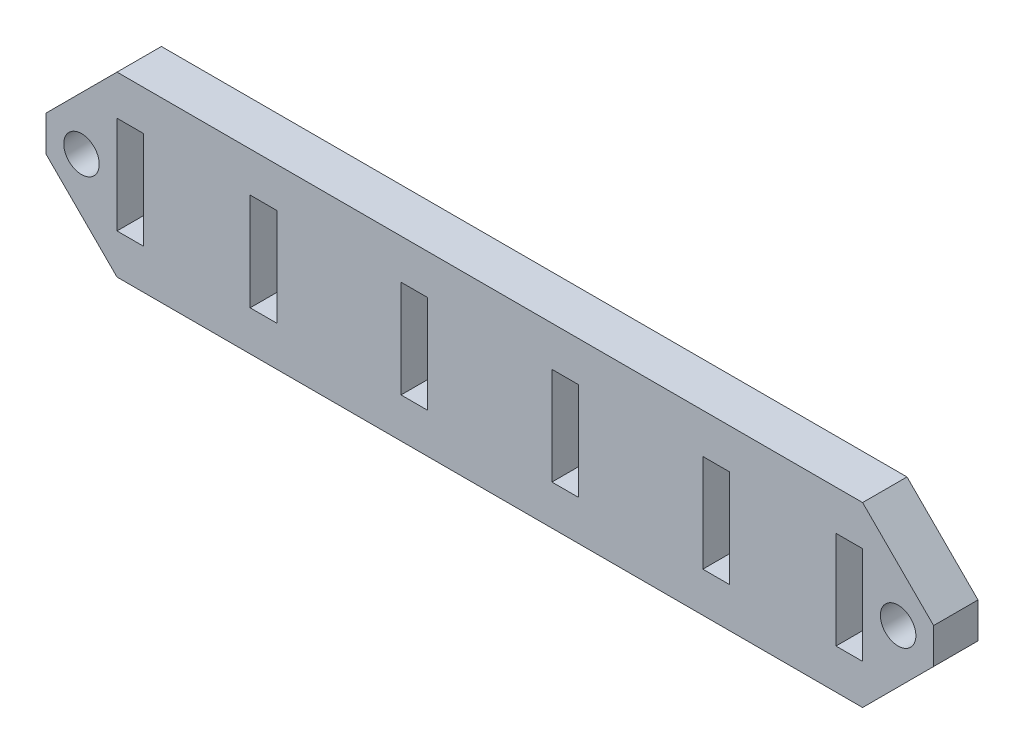
ISO-10303-21;
HEADER;
FILE_DESCRIPTION(('STEP AP214'),'2;1');
FILE_NAME('part.step','',(''),(''),'','','');
FILE_SCHEMA(('AUTOMOTIVE_DESIGN { 1 0 10303 214 1 1 1 1 }'));
ENDSEC;
DATA;
#1=APPLICATION_CONTEXT('core data for automotive mechanical design processes');
#2=APPLICATION_PROTOCOL_DEFINITION('international standard','automotive_design',2000,#1);
#3=PRODUCT_CONTEXT('',#1,'mechanical');
#4=PRODUCT('Part','Part','',(#3));
#5=PRODUCT_RELATED_PRODUCT_CATEGORY('part','',(#4));
#6=PRODUCT_DEFINITION_FORMATION('','',#4);
#7=PRODUCT_DEFINITION_CONTEXT('part definition',#1,'design');
#8=PRODUCT_DEFINITION('design','',#6,#7);
#9=PRODUCT_DEFINITION_SHAPE('','',#8);
#10=(LENGTH_UNIT() NAMED_UNIT(*) SI_UNIT(.MILLI.,.METRE.));
#11=(NAMED_UNIT(*) PLANE_ANGLE_UNIT() SI_UNIT($,.RADIAN.));
#12=(NAMED_UNIT(*) SI_UNIT($,.STERADIAN.) SOLID_ANGLE_UNIT());
#13=UNCERTAINTY_MEASURE_WITH_UNIT(LENGTH_MEASURE(1.E-05),#10,'distance_accuracy_value','');
#14=(GEOMETRIC_REPRESENTATION_CONTEXT(3) GLOBAL_UNCERTAINTY_ASSIGNED_CONTEXT((#13)) GLOBAL_UNIT_ASSIGNED_CONTEXT((#10,
#11,#12)) REPRESENTATION_CONTEXT('',''));
#15=CARTESIAN_POINT('',(0.,0.,0.));
#16=DIRECTION('',(0.,0.,1.));
#17=DIRECTION('',(1.,0.,0.));
#18=AXIS2_PLACEMENT_3D('',#15,#16,#17);
#19=CARTESIAN_POINT('',(100.,20.,5.));
#20=DIRECTION('',(1.,0.,0.));
#21=DIRECTION('',(0.,1.,0.));
#22=AXIS2_PLACEMENT_3D('',#19,#20,#21);
#23=PLANE('',#22);
#24=DIRECTION('',(0.,0.,-1.));
#25=VECTOR('',#24,1.);
#26=CARTESIAN_POINT('',(100.,8.,5.));
#27=LINE('',#26,#25);
#28=CARTESIAN_POINT('',(100.,8.,5.));
#29=VERTEX_POINT('',#28);
#30=CARTESIAN_POINT('',(100.,8.,0.));
#31=VERTEX_POINT('',#30);
#32=EDGE_CURVE('E604',#29,#31,#27,.T.);
#33=ORIENTED_EDGE('',*,*,#32,.T.);
#34=DIRECTION('',(0.,-1.,0.));
#35=VECTOR('',#34,1.);
#36=CARTESIAN_POINT('',(100.,20.,0.));
#37=LINE('',#36,#35);
#38=CARTESIAN_POINT('',(100.,12.,0.));
#39=VERTEX_POINT('',#38);
#40=EDGE_CURVE('E279',#39,#31,#37,.T.);
#41=ORIENTED_EDGE('',*,*,#40,.F.);
#42=DIRECTION('',(0.,0.,-1.));
#43=VECTOR('',#42,1.);
#44=CARTESIAN_POINT('',(100.,12.,5.));
#45=LINE('',#44,#43);
#46=CARTESIAN_POINT('',(100.,12.,5.));
#47=VERTEX_POINT('',#46);
#48=EDGE_CURVE('E580',#47,#39,#45,.T.);
#49=ORIENTED_EDGE('',*,*,#48,.F.);
#50=DIRECTION('',(0.,-1.,0.));
#51=VECTOR('',#50,1.);
#52=CARTESIAN_POINT('',(100.,20.,5.));
#53=LINE('',#52,#51);
#54=EDGE_CURVE('E275',#47,#29,#53,.T.);
#55=ORIENTED_EDGE('',*,*,#54,.T.);
#56=EDGE_LOOP('',(#33,#41,#49,#55));
#57=FACE_BOUND('',#56,.T.);
#58=ADVANCED_FACE('F39',(#57),#23,.T.);
#59=CARTESIAN_POINT('',(100.,20.,5.));
#60=DIRECTION('',(0.,-1.,0.));
#61=DIRECTION('',(0.,0.,-1.));
#62=AXIS2_PLACEMENT_3D('',#59,#60,#61);
#63=PLANE('',#62);
#64=DIRECTION('',(-1.,0.,0.));
#65=VECTOR('',#64,1.);
#66=CARTESIAN_POINT('',(100.,20.,0.));
#67=LINE('',#66,#65);
#68=CARTESIAN_POINT('',(92.,20.,0.));
#69=VERTEX_POINT('',#68);
#70=CARTESIAN_POINT('',(8.00000000000001,20.,0.));
#71=VERTEX_POINT('',#70);
#72=EDGE_CURVE('E42',#69,#71,#67,.T.);
#73=ORIENTED_EDGE('',*,*,#72,.T.);
#74=DIRECTION('',(0.,0.,-1.));
#75=VECTOR('',#74,1.);
#76=CARTESIAN_POINT('',(8.,20.,5.));
#77=LINE('',#76,#75);
#78=CARTESIAN_POINT('',(8.,20.,5.));
#79=VERTEX_POINT('',#78);
#80=EDGE_CURVE('E56',#79,#71,#77,.T.);
#81=ORIENTED_EDGE('',*,*,#80,.F.);
#82=DIRECTION('',(-1.,0.,0.));
#83=VECTOR('',#82,1.);
#84=CARTESIAN_POINT('',(100.,20.,5.));
#85=LINE('',#84,#83);
#86=CARTESIAN_POINT('',(92.,20.,5.));
#87=VERTEX_POINT('',#86);
#88=EDGE_CURVE('E11',#87,#79,#85,.T.);
#89=ORIENTED_EDGE('',*,*,#88,.F.);
#90=DIRECTION('',(0.,0.,-1.));
#91=VECTOR('',#90,1.);
#92=CARTESIAN_POINT('',(92.,20.,5.));
#93=LINE('',#92,#91);
#94=EDGE_CURVE('E525',#87,#69,#93,.T.);
#95=ORIENTED_EDGE('',*,*,#94,.T.);
#96=EDGE_LOOP('',(#73,#81,#89,#95));
#97=FACE_BOUND('',#96,.T.);
#98=ADVANCED_FACE('F632',(#97),#63,.F.);
#99=CARTESIAN_POINT('',(0.,20.,5.));
#100=DIRECTION('',(1.,0.,0.));
#101=DIRECTION('',(0.,0.,-1.));
#102=AXIS2_PLACEMENT_3D('',#99,#100,#101);
#103=PLANE('',#102);
#104=DIRECTION('',(0.,-1.,0.));
#105=VECTOR('',#104,1.);
#106=CARTESIAN_POINT('',(0.,20.,5.));
#107=LINE('',#106,#105);
#108=CARTESIAN_POINT('',(0.,12.,5.));
#109=VERTEX_POINT('',#108);
#110=CARTESIAN_POINT('',(0.,8.,5.));
#111=VERTEX_POINT('',#110);
#112=EDGE_CURVE('E48',#109,#111,#107,.T.);
#113=ORIENTED_EDGE('',*,*,#112,.F.);
#114=DIRECTION('',(0.,0.,-1.));
#115=VECTOR('',#114,1.);
#116=CARTESIAN_POINT('',(0.,12.,5.));
#117=LINE('',#116,#115);
#118=CARTESIAN_POINT('',(0.,12.,0.));
#119=VERTEX_POINT('',#118);
#120=EDGE_CURVE('E593',#109,#119,#117,.T.);
#121=ORIENTED_EDGE('',*,*,#120,.T.);
#122=DIRECTION('',(0.,-1.,0.));
#123=VECTOR('',#122,1.);
#124=CARTESIAN_POINT('',(0.,20.,0.));
#125=LINE('',#124,#123);
#126=CARTESIAN_POINT('',(0.,8.,0.));
#127=VERTEX_POINT('',#126);
#128=EDGE_CURVE('E265',#119,#127,#125,.T.);
#129=ORIENTED_EDGE('',*,*,#128,.T.);
#130=DIRECTION('',(0.,0.,-1.));
#131=VECTOR('',#130,1.);
#132=CARTESIAN_POINT('',(0.,8.,5.));
#133=LINE('',#132,#131);
#134=EDGE_CURVE('E64',#111,#127,#133,.T.);
#135=ORIENTED_EDGE('',*,*,#134,.F.);
#136=EDGE_LOOP('',(#113,#121,#129,#135));
#137=FACE_BOUND('',#136,.T.);
#138=ADVANCED_FACE('F262',(#137),#103,.F.);
#139=CARTESIAN_POINT('',(100.,0.,5.));
#140=DIRECTION('',(0.,-1.,0.));
#141=DIRECTION('',(1.,0.,0.));
#142=AXIS2_PLACEMENT_3D('',#139,#140,#141);
#143=PLANE('',#142);
#144=DIRECTION('',(0.,0.,-1.));
#145=VECTOR('',#144,1.);
#146=CARTESIAN_POINT('',(92.,0.,5.));
#147=LINE('',#146,#145);
#148=CARTESIAN_POINT('',(92.,0.,5.));
#149=VERTEX_POINT('',#148);
#150=CARTESIAN_POINT('',(92.,0.,0.));
#151=VERTEX_POINT('',#150);
#152=EDGE_CURVE('E589',#149,#151,#147,.T.);
#153=ORIENTED_EDGE('',*,*,#152,.F.);
#154=DIRECTION('',(-1.,0.,0.));
#155=VECTOR('',#154,1.);
#156=CARTESIAN_POINT('',(100.,0.,5.));
#157=LINE('',#156,#155);
#158=CARTESIAN_POINT('',(8.00000000000001,0.,5.));
#159=VERTEX_POINT('',#158);
#160=EDGE_CURVE('E272',#149,#159,#157,.T.);
#161=ORIENTED_EDGE('',*,*,#160,.T.);
#162=DIRECTION('',(0.,0.,-1.));
#163=VECTOR('',#162,1.);
#164=CARTESIAN_POINT('',(8.00000000000001,0.,5.));
#165=LINE('',#164,#163);
#166=CARTESIAN_POINT('',(8.00000000000001,0.,0.));
#167=VERTEX_POINT('',#166);
#168=EDGE_CURVE('E251',#159,#167,#165,.T.);
#169=ORIENTED_EDGE('',*,*,#168,.T.);
#170=DIRECTION('',(-1.,0.,0.));
#171=VECTOR('',#170,1.);
#172=CARTESIAN_POINT('',(100.,0.,0.));
#173=LINE('',#172,#171);
#174=EDGE_CURVE('E283',#151,#167,#173,.T.);
#175=ORIENTED_EDGE('',*,*,#174,.F.);
#176=EDGE_LOOP('',(#153,#161,#169,#175));
#177=FACE_BOUND('',#176,.T.);
#178=ADVANCED_FACE('F622',(#177),#143,.T.);
#179=CARTESIAN_POINT('',(0.,0.,5.));
#180=DIRECTION('',(0.,0.,-1.));
#181=DIRECTION('',(-1.,0.,0.));
#182=AXIS2_PLACEMENT_3D('',#179,#180,#181);
#183=PLANE('',#182);
#184=DIRECTION('',(1.,0.,0.));
#185=VECTOR('',#184,1.);
#186=CARTESIAN_POINT('',(77.,15.5,5.));
#187=LINE('',#186,#185);
#188=CARTESIAN_POINT('',(74.,15.5,5.));
#189=VERTEX_POINT('',#188);
#190=CARTESIAN_POINT('',(77.,15.5,5.));
#191=VERTEX_POINT('',#190);
#192=EDGE_CURVE('E483',#189,#191,#187,.T.);
#193=ORIENTED_EDGE('',*,*,#192,.T.);
#194=DIRECTION('',(0.,-1.,0.));
#195=VECTOR('',#194,1.);
#196=CARTESIAN_POINT('',(77.,4.5,5.));
#197=LINE('',#196,#195);
#198=CARTESIAN_POINT('',(77.,4.5,5.));
#199=VERTEX_POINT('',#198);
#200=EDGE_CURVE('E495',#191,#199,#197,.T.);
#201=ORIENTED_EDGE('',*,*,#200,.T.);
#202=DIRECTION('',(-1.,0.,0.));
#203=VECTOR('',#202,1.);
#204=CARTESIAN_POINT('',(77.,4.5,5.));
#205=LINE('',#204,#203);
#206=CARTESIAN_POINT('',(74.,4.5,5.));
#207=VERTEX_POINT('',#206);
#208=EDGE_CURVE('E513',#199,#207,#205,.T.);
#209=ORIENTED_EDGE('',*,*,#208,.T.);
#210=DIRECTION('',(0.,1.,0.));
#211=VECTOR('',#210,1.);
#212=CARTESIAN_POINT('',(74.,4.5,5.));
#213=LINE('',#212,#211);
#214=EDGE_CURVE('E509',#207,#189,#213,.T.);
#215=ORIENTED_EDGE('',*,*,#214,.T.);
#216=EDGE_LOOP('',(#193,#201,#209,#215));
#217=FACE_BOUND('',#216,.T.);
#218=DIRECTION('',(1.,0.,0.));
#219=VECTOR('',#218,1.);
#220=CARTESIAN_POINT('',(60.,15.5,5.));
#221=LINE('',#220,#219);
#222=CARTESIAN_POINT('',(57.,15.5,5.));
#223=VERTEX_POINT('',#222);
#224=CARTESIAN_POINT('',(60.,15.5,5.));
#225=VERTEX_POINT('',#224);
#226=EDGE_CURVE('E439',#223,#225,#221,.T.);
#227=ORIENTED_EDGE('',*,*,#226,.T.);
#228=DIRECTION('',(0.,-1.,0.));
#229=VECTOR('',#228,1.);
#230=CARTESIAN_POINT('',(60.,15.5,5.));
#231=LINE('',#230,#229);
#232=CARTESIAN_POINT('',(60.,4.5,5.));
#233=VERTEX_POINT('',#232);
#234=EDGE_CURVE('E453',#225,#233,#231,.T.);
#235=ORIENTED_EDGE('',*,*,#234,.T.);
#236=DIRECTION('',(-1.,0.,0.));
#237=VECTOR('',#236,1.);
#238=CARTESIAN_POINT('',(60.,4.5,5.));
#239=LINE('',#238,#237);
#240=CARTESIAN_POINT('',(57.,4.5,5.));
#241=VERTEX_POINT('',#240);
#242=EDGE_CURVE('E471',#233,#241,#239,.T.);
#243=ORIENTED_EDGE('',*,*,#242,.T.);
#244=DIRECTION('',(0.,1.,0.));
#245=VECTOR('',#244,1.);
#246=CARTESIAN_POINT('',(57.,15.5,5.));
#247=LINE('',#246,#245);
#248=EDGE_CURVE('E467',#241,#223,#247,.T.);
#249=ORIENTED_EDGE('',*,*,#248,.T.);
#250=EDGE_LOOP('',(#227,#235,#243,#249));
#251=FACE_BOUND('',#250,.T.);
#252=DIRECTION('',(1.,0.,0.));
#253=VECTOR('',#252,1.);
#254=CARTESIAN_POINT('',(43.,15.5,5.));
#255=LINE('',#254,#253);
#256=CARTESIAN_POINT('',(40.,15.5,5.));
#257=VERTEX_POINT('',#256);
#258=CARTESIAN_POINT('',(43.,15.5,5.));
#259=VERTEX_POINT('',#258);
#260=EDGE_CURVE('E395',#257,#259,#255,.T.);
#261=ORIENTED_EDGE('',*,*,#260,.T.);
#262=DIRECTION('',(0.,-1.,0.));
#263=VECTOR('',#262,1.);
#264=CARTESIAN_POINT('',(43.,15.5,5.));
#265=LINE('',#264,#263);
#266=CARTESIAN_POINT('',(43.,4.5,5.));
#267=VERTEX_POINT('',#266);
#268=EDGE_CURVE('E409',#259,#267,#265,.T.);
#269=ORIENTED_EDGE('',*,*,#268,.T.);
#270=DIRECTION('',(-1.,0.,0.));
#271=VECTOR('',#270,1.);
#272=CARTESIAN_POINT('',(43.,4.5,5.));
#273=LINE('',#272,#271);
#274=CARTESIAN_POINT('',(40.,4.5,5.));
#275=VERTEX_POINT('',#274);
#276=EDGE_CURVE('E427',#267,#275,#273,.T.);
#277=ORIENTED_EDGE('',*,*,#276,.T.);
#278=DIRECTION('',(0.,1.,0.));
#279=VECTOR('',#278,1.);
#280=CARTESIAN_POINT('',(40.,15.5,5.));
#281=LINE('',#280,#279);
#282=EDGE_CURVE('E423',#275,#257,#281,.T.);
#283=ORIENTED_EDGE('',*,*,#282,.T.);
#284=EDGE_LOOP('',(#261,#269,#277,#283));
#285=FACE_BOUND('',#284,.T.);
#286=DIRECTION('',(1.,0.,0.));
#287=VECTOR('',#286,1.);
#288=CARTESIAN_POINT('',(26.,15.5,5.));
#289=LINE('',#288,#287);
#290=CARTESIAN_POINT('',(23.,15.5,5.));
#291=VERTEX_POINT('',#290);
#292=CARTESIAN_POINT('',(26.,15.5,5.));
#293=VERTEX_POINT('',#292);
#294=EDGE_CURVE('E349',#291,#293,#289,.T.);
#295=ORIENTED_EDGE('',*,*,#294,.T.);
#296=DIRECTION('',(0.,-1.,0.));
#297=VECTOR('',#296,1.);
#298=CARTESIAN_POINT('',(26.,15.5,5.));
#299=LINE('',#298,#297);
#300=CARTESIAN_POINT('',(26.,4.50000000000002,5.));
#301=VERTEX_POINT('',#300);
#302=EDGE_CURVE('E363',#293,#301,#299,.T.);
#303=ORIENTED_EDGE('',*,*,#302,.T.);
#304=DIRECTION('',(-1.,0.,0.));
#305=VECTOR('',#304,1.);
#306=CARTESIAN_POINT('',(26.,4.50000000000002,5.));
#307=LINE('',#306,#305);
#308=CARTESIAN_POINT('',(23.,4.50000000000002,5.));
#309=VERTEX_POINT('',#308);
#310=EDGE_CURVE('E383',#301,#309,#307,.T.);
#311=ORIENTED_EDGE('',*,*,#310,.T.);
#312=DIRECTION('',(0.,1.,0.));
#313=VECTOR('',#312,1.);
#314=CARTESIAN_POINT('',(23.,15.5,5.));
#315=LINE('',#314,#313);
#316=EDGE_CURVE('E379',#309,#291,#315,.T.);
#317=ORIENTED_EDGE('',*,*,#316,.T.);
#318=EDGE_LOOP('',(#295,#303,#311,#317));
#319=FACE_BOUND('',#318,.T.);
#320=DIRECTION('',(1.,0.,0.));
#321=VECTOR('',#320,1.);
#322=CARTESIAN_POINT('',(11.,15.5,5.));
#323=LINE('',#322,#321);
#324=CARTESIAN_POINT('',(8.,15.5,5.));
#325=VERTEX_POINT('',#324);
#326=CARTESIAN_POINT('',(11.,15.5,5.));
#327=VERTEX_POINT('',#326);
#328=EDGE_CURVE('E543',#325,#327,#323,.T.);
#329=ORIENTED_EDGE('',*,*,#328,.T.);
#330=DIRECTION('',(0.,-1.,0.));
#331=VECTOR('',#330,1.);
#332=CARTESIAN_POINT('',(11.,15.5,5.));
#333=LINE('',#332,#331);
#334=CARTESIAN_POINT('',(11.,4.5,5.));
#335=VERTEX_POINT('',#334);
#336=EDGE_CURVE('E555',#327,#335,#333,.T.);
#337=ORIENTED_EDGE('',*,*,#336,.T.);
#338=DIRECTION('',(-1.,0.,0.));
#339=VECTOR('',#338,1.);
#340=CARTESIAN_POINT('',(11.,4.5,5.));
#341=LINE('',#340,#339);
#342=CARTESIAN_POINT('',(8.,4.5,5.));
#343=VERTEX_POINT('',#342);
#344=EDGE_CURVE('E573',#335,#343,#341,.T.);
#345=ORIENTED_EDGE('',*,*,#344,.T.);
#346=DIRECTION('',(0.,1.,0.));
#347=VECTOR('',#346,1.);
#348=CARTESIAN_POINT('',(8.,15.5,5.));
#349=LINE('',#348,#347);
#350=EDGE_CURVE('E569',#343,#325,#349,.T.);
#351=ORIENTED_EDGE('',*,*,#350,.T.);
#352=EDGE_LOOP('',(#329,#337,#345,#351));
#353=FACE_BOUND('',#352,.T.);
#354=CARTESIAN_POINT('',(96.,10.,5.));
#355=DIRECTION('',(0.,0.,-1.));
#356=DIRECTION('',(-1.,0.,0.));
#357=AXIS2_PLACEMENT_3D('',#354,#355,#356);
#358=CIRCLE('',#357,2.);
#359=CARTESIAN_POINT('',(94.,10.,5.));
#360=VERTEX_POINT('',#359);
#361=EDGE_CURVE('E533',#360,#360,#358,.T.);
#362=ORIENTED_EDGE('',*,*,#361,.T.);
#363=EDGE_LOOP('',(#362));
#364=FACE_BOUND('',#363,.T.);
#365=CARTESIAN_POINT('',(4.,10.,5.));
#366=DIRECTION('',(0.,0.,-1.));
#367=DIRECTION('',(-1.,0.,0.));
#368=AXIS2_PLACEMENT_3D('',#365,#366,#367);
#369=CIRCLE('',#368,2.);
#370=CARTESIAN_POINT('',(2.,10.,5.));
#371=VERTEX_POINT('',#370);
#372=EDGE_CURVE('E524',#371,#371,#369,.T.);
#373=ORIENTED_EDGE('',*,*,#372,.T.);
#374=EDGE_LOOP('',(#373));
#375=FACE_BOUND('',#374,.T.);
#376=DIRECTION('',(1.,0.,0.));
#377=VECTOR('',#376,1.);
#378=CARTESIAN_POINT('',(92.,15.5,5.));
#379=LINE('',#378,#377);
#380=CARTESIAN_POINT('',(89.,15.5,5.));
#381=VERTEX_POINT('',#380);
#382=CARTESIAN_POINT('',(92.,15.5,5.));
#383=VERTEX_POINT('',#382);
#384=EDGE_CURVE('E305',#381,#383,#379,.T.);
#385=ORIENTED_EDGE('',*,*,#384,.T.);
#386=DIRECTION('',(0.,-1.,0.));
#387=VECTOR('',#386,1.);
#388=CARTESIAN_POINT('',(92.,15.5,5.));
#389=LINE('',#388,#387);
#390=CARTESIAN_POINT('',(92.,4.5,5.));
#391=VERTEX_POINT('',#390);
#392=EDGE_CURVE('E317',#383,#391,#389,.T.);
#393=ORIENTED_EDGE('',*,*,#392,.T.);
#394=DIRECTION('',(-1.,0.,0.));
#395=VECTOR('',#394,1.);
#396=CARTESIAN_POINT('',(92.,4.5,5.));
#397=LINE('',#396,#395);
#398=CARTESIAN_POINT('',(89.,4.5,5.));
#399=VERTEX_POINT('',#398);
#400=EDGE_CURVE('E337',#391,#399,#397,.T.);
#401=ORIENTED_EDGE('',*,*,#400,.T.);
#402=DIRECTION('',(0.,1.,0.));
#403=VECTOR('',#402,1.);
#404=CARTESIAN_POINT('',(89.,15.5,5.));
#405=LINE('',#404,#403);
#406=EDGE_CURVE('E333',#399,#381,#405,.T.);
#407=ORIENTED_EDGE('',*,*,#406,.T.);
#408=EDGE_LOOP('',(#385,#393,#401,#407));
#409=FACE_BOUND('',#408,.T.);
#410=ORIENTED_EDGE('',*,*,#160,.F.);
#411=DIRECTION('',(0.707106781186547,0.707106781186548,0.));
#412=VECTOR('',#411,1.);
#413=CARTESIAN_POINT('',(92.,0.,5.));
#414=LINE('',#413,#412);
#415=EDGE_CURVE('E607',#149,#29,#414,.T.);
#416=ORIENTED_EDGE('',*,*,#415,.T.);
#417=ORIENTED_EDGE('',*,*,#54,.F.);
#418=DIRECTION('',(-0.707106781186548,0.707106781186547,0.));
#419=VECTOR('',#418,1.);
#420=CARTESIAN_POINT('',(92.,20.,5.));
#421=LINE('',#420,#419);
#422=EDGE_CURVE('E583',#47,#87,#421,.T.);
#423=ORIENTED_EDGE('',*,*,#422,.T.);
#424=ORIENTED_EDGE('',*,*,#88,.T.);
#425=DIRECTION('',(-0.707106781186548,-0.707106781186548,0.));
#426=VECTOR('',#425,1.);
#427=CARTESIAN_POINT('',(0.,12.,5.));
#428=LINE('',#427,#426);
#429=EDGE_CURVE('E270',#79,#109,#428,.T.);
#430=ORIENTED_EDGE('',*,*,#429,.T.);
#431=ORIENTED_EDGE('',*,*,#112,.T.);
#432=DIRECTION('',(0.707106781186548,-0.707106781186547,0.));
#433=VECTOR('',#432,1.);
#434=CARTESIAN_POINT('',(0.,8.,5.));
#435=LINE('',#434,#433);
#436=EDGE_CURVE('E248',#111,#159,#435,.T.);
#437=ORIENTED_EDGE('',*,*,#436,.T.);
#438=EDGE_LOOP('',(#410,#416,#417,#423,#424,#430,#431,#437));
#439=FACE_BOUND('',#438,.T.);
#440=ADVANCED_FACE('F269',(#217,#251,#285,#319,#353,#364,#375,#409,#439),#183,.F.);
#441=CARTESIAN_POINT('',(0.,0.,0.));
#442=DIRECTION('',(0.,0.,-1.));
#443=DIRECTION('',(-1.,0.,0.));
#444=AXIS2_PLACEMENT_3D('',#441,#442,#443);
#445=PLANE('',#444);
#446=DIRECTION('',(0.707106781186547,0.707106781186548,0.));
#447=VECTOR('',#446,1.);
#448=CARTESIAN_POINT('',(92.,0.,0.));
#449=LINE('',#448,#447);
#450=EDGE_CURVE('E598',#151,#31,#449,.T.);
#451=ORIENTED_EDGE('',*,*,#450,.F.);
#452=ORIENTED_EDGE('',*,*,#174,.T.);
#453=DIRECTION('',(0.707106781186548,-0.707106781186547,0.));
#454=VECTOR('',#453,1.);
#455=CARTESIAN_POINT('',(0.,8.,0.));
#456=LINE('',#455,#454);
#457=EDGE_CURVE('E257',#127,#167,#456,.T.);
#458=ORIENTED_EDGE('',*,*,#457,.F.);
#459=ORIENTED_EDGE('',*,*,#128,.F.);
#460=DIRECTION('',(-0.707106781186548,-0.707106781186548,0.));
#461=VECTOR('',#460,1.);
#462=CARTESIAN_POINT('',(0.,12.,0.));
#463=LINE('',#462,#461);
#464=EDGE_CURVE('E599',#71,#119,#463,.T.);
#465=ORIENTED_EDGE('',*,*,#464,.F.);
#466=ORIENTED_EDGE('',*,*,#72,.F.);
#467=DIRECTION('',(-0.707106781186548,0.707106781186547,0.));
#468=VECTOR('',#467,1.);
#469=CARTESIAN_POINT('',(92.,20.,0.));
#470=LINE('',#469,#468);
#471=EDGE_CURVE('E586',#39,#69,#470,.T.);
#472=ORIENTED_EDGE('',*,*,#471,.F.);
#473=ORIENTED_EDGE('',*,*,#40,.T.);
#474=EDGE_LOOP('',(#451,#452,#458,#459,#465,#466,#472,#473));
#475=FACE_BOUND('',#474,.T.);
#476=DIRECTION('',(0.,-1.,0.));
#477=VECTOR('',#476,1.);
#478=CARTESIAN_POINT('',(77.,4.5,0.));
#479=LINE('',#478,#477);
#480=CARTESIAN_POINT('',(77.,15.5,0.));
#481=VERTEX_POINT('',#480);
#482=CARTESIAN_POINT('',(77.,4.5,0.));
#483=VERTEX_POINT('',#482);
#484=EDGE_CURVE('E448',#481,#483,#479,.T.);
#485=ORIENTED_EDGE('',*,*,#484,.F.);
#486=DIRECTION('',(1.,0.,0.));
#487=VECTOR('',#486,1.);
#488=CARTESIAN_POINT('',(77.,15.5,0.));
#489=LINE('',#488,#487);
#490=CARTESIAN_POINT('',(74.,15.5,0.));
#491=VERTEX_POINT('',#490);
#492=EDGE_CURVE('E491',#491,#481,#489,.T.);
#493=ORIENTED_EDGE('',*,*,#492,.F.);
#494=DIRECTION('',(0.,1.,0.));
#495=VECTOR('',#494,1.);
#496=CARTESIAN_POINT('',(74.,4.5,0.));
#497=LINE('',#496,#495);
#498=CARTESIAN_POINT('',(74.,4.5,0.));
#499=VERTEX_POINT('',#498);
#500=EDGE_CURVE('E496',#499,#491,#497,.T.);
#501=ORIENTED_EDGE('',*,*,#500,.F.);
#502=DIRECTION('',(-1.,0.,0.));
#503=VECTOR('',#502,1.);
#504=CARTESIAN_POINT('',(77.,4.5,0.));
#505=LINE('',#504,#503);
#506=EDGE_CURVE('E500',#483,#499,#505,.T.);
#507=ORIENTED_EDGE('',*,*,#506,.F.);
#508=EDGE_LOOP('',(#485,#493,#501,#507));
#509=FACE_BOUND('',#508,.T.);
#510=DIRECTION('',(0.,-1.,0.));
#511=VECTOR('',#510,1.);
#512=CARTESIAN_POINT('',(60.,15.5,0.));
#513=LINE('',#512,#511);
#514=CARTESIAN_POINT('',(60.,15.5,0.));
#515=VERTEX_POINT('',#514);
#516=CARTESIAN_POINT('',(60.,4.5,0.));
#517=VERTEX_POINT('',#516);
#518=EDGE_CURVE('E404',#515,#517,#513,.T.);
#519=ORIENTED_EDGE('',*,*,#518,.F.);
#520=DIRECTION('',(1.,0.,0.));
#521=VECTOR('',#520,1.);
#522=CARTESIAN_POINT('',(60.,15.5,0.));
#523=LINE('',#522,#521);
#524=CARTESIAN_POINT('',(57.,15.5,0.));
#525=VERTEX_POINT('',#524);
#526=EDGE_CURVE('E449',#525,#515,#523,.T.);
#527=ORIENTED_EDGE('',*,*,#526,.F.);
#528=DIRECTION('',(0.,1.,0.));
#529=VECTOR('',#528,1.);
#530=CARTESIAN_POINT('',(57.,15.5,0.));
#531=LINE('',#530,#529);
#532=CARTESIAN_POINT('',(57.,4.5,0.));
#533=VERTEX_POINT('',#532);
#534=EDGE_CURVE('E454',#533,#525,#531,.T.);
#535=ORIENTED_EDGE('',*,*,#534,.F.);
#536=DIRECTION('',(-1.,0.,0.));
#537=VECTOR('',#536,1.);
#538=CARTESIAN_POINT('',(60.,4.5,0.));
#539=LINE('',#538,#537);
#540=EDGE_CURVE('E458',#517,#533,#539,.T.);
#541=ORIENTED_EDGE('',*,*,#540,.F.);
#542=EDGE_LOOP('',(#519,#527,#535,#541));
#543=FACE_BOUND('',#542,.T.);
#544=DIRECTION('',(0.,-1.,0.));
#545=VECTOR('',#544,1.);
#546=CARTESIAN_POINT('',(43.,15.5,0.));
#547=LINE('',#546,#545);
#548=CARTESIAN_POINT('',(43.,15.5,0.));
#549=VERTEX_POINT('',#548);
#550=CARTESIAN_POINT('',(43.,4.5,0.));
#551=VERTEX_POINT('',#550);
#552=EDGE_CURVE('E358',#549,#551,#547,.T.);
#553=ORIENTED_EDGE('',*,*,#552,.F.);
#554=DIRECTION('',(1.,0.,0.));
#555=VECTOR('',#554,1.);
#556=CARTESIAN_POINT('',(43.,15.5,0.));
#557=LINE('',#556,#555);
#558=CARTESIAN_POINT('',(40.,15.5,0.));
#559=VERTEX_POINT('',#558);
#560=EDGE_CURVE('E405',#559,#549,#557,.T.);
#561=ORIENTED_EDGE('',*,*,#560,.F.);
#562=DIRECTION('',(0.,1.,0.));
#563=VECTOR('',#562,1.);
#564=CARTESIAN_POINT('',(40.,15.5,0.));
#565=LINE('',#564,#563);
#566=CARTESIAN_POINT('',(40.,4.5,0.));
#567=VERTEX_POINT('',#566);
#568=EDGE_CURVE('E410',#567,#559,#565,.T.);
#569=ORIENTED_EDGE('',*,*,#568,.F.);
#570=DIRECTION('',(-1.,0.,0.));
#571=VECTOR('',#570,1.);
#572=CARTESIAN_POINT('',(43.,4.5,0.));
#573=LINE('',#572,#571);
#574=EDGE_CURVE('E414',#551,#567,#573,.T.);
#575=ORIENTED_EDGE('',*,*,#574,.F.);
#576=EDGE_LOOP('',(#553,#561,#569,#575));
#577=FACE_BOUND('',#576,.T.);
#578=DIRECTION('',(0.,-1.,0.));
#579=VECTOR('',#578,1.);
#580=CARTESIAN_POINT('',(26.,15.5,0.));
#581=LINE('',#580,#579);
#582=CARTESIAN_POINT('',(26.,15.5,0.));
#583=VERTEX_POINT('',#582);
#584=CARTESIAN_POINT('',(26.,4.50000000000002,0.));
#585=VERTEX_POINT('',#584);
#586=EDGE_CURVE('E372',#583,#585,#581,.T.);
#587=ORIENTED_EDGE('',*,*,#586,.F.);
#588=DIRECTION('',(1.,0.,0.));
#589=VECTOR('',#588,1.);
#590=CARTESIAN_POINT('',(26.,15.5,0.));
#591=LINE('',#590,#589);
#592=CARTESIAN_POINT('',(23.,15.5,0.));
#593=VERTEX_POINT('',#592);
#594=EDGE_CURVE('E359',#593,#583,#591,.T.);
#595=ORIENTED_EDGE('',*,*,#594,.F.);
#596=DIRECTION('',(0.,1.,0.));
#597=VECTOR('',#596,1.);
#598=CARTESIAN_POINT('',(23.,15.5,0.));
#599=LINE('',#598,#597);
#600=CARTESIAN_POINT('',(23.,4.50000000000002,0.));
#601=VERTEX_POINT('',#600);
#602=EDGE_CURVE('E364',#601,#593,#599,.T.);
#603=ORIENTED_EDGE('',*,*,#602,.F.);
#604=DIRECTION('',(-1.,0.,0.));
#605=VECTOR('',#604,1.);
#606=CARTESIAN_POINT('',(26.,4.50000000000002,0.));
#607=LINE('',#606,#605);
#608=EDGE_CURVE('E368',#585,#601,#607,.T.);
#609=ORIENTED_EDGE('',*,*,#608,.F.);
#610=EDGE_LOOP('',(#587,#595,#603,#609));
#611=FACE_BOUND('',#610,.T.);
#612=DIRECTION('',(0.,-1.,0.));
#613=VECTOR('',#612,1.);
#614=CARTESIAN_POINT('',(11.,15.5,0.));
#615=LINE('',#614,#613);
#616=CARTESIAN_POINT('',(11.,15.5,0.));
#617=VERTEX_POINT('',#616);
#618=CARTESIAN_POINT('',(11.,4.5,0.));
#619=VERTEX_POINT('',#618);
#620=EDGE_CURVE('E537',#617,#619,#615,.T.);
#621=ORIENTED_EDGE('',*,*,#620,.F.);
#622=DIRECTION('',(1.,0.,0.));
#623=VECTOR('',#622,1.);
#624=CARTESIAN_POINT('',(11.,15.5,0.));
#625=LINE('',#624,#623);
#626=CARTESIAN_POINT('',(8.,15.5,0.));
#627=VERTEX_POINT('',#626);
#628=EDGE_CURVE('E551',#627,#617,#625,.T.);
#629=ORIENTED_EDGE('',*,*,#628,.F.);
#630=DIRECTION('',(0.,1.,0.));
#631=VECTOR('',#630,1.);
#632=CARTESIAN_POINT('',(8.,15.5,0.));
#633=LINE('',#632,#631);
#634=CARTESIAN_POINT('',(8.,4.5,0.));
#635=VERTEX_POINT('',#634);
#636=EDGE_CURVE('E556',#635,#627,#633,.T.);
#637=ORIENTED_EDGE('',*,*,#636,.F.);
#638=DIRECTION('',(-1.,0.,0.));
#639=VECTOR('',#638,1.);
#640=CARTESIAN_POINT('',(11.,4.5,0.));
#641=LINE('',#640,#639);
#642=EDGE_CURVE('E560',#619,#635,#641,.T.);
#643=ORIENTED_EDGE('',*,*,#642,.F.);
#644=EDGE_LOOP('',(#621,#629,#637,#643));
#645=FACE_BOUND('',#644,.T.);
#646=CARTESIAN_POINT('',(96.,10.,0.));
#647=DIRECTION('',(0.,0.,-1.));
#648=DIRECTION('',(-1.,0.,0.));
#649=AXIS2_PLACEMENT_3D('',#646,#647,#648);
#650=CIRCLE('',#649,2.);
#651=CARTESIAN_POINT('',(94.,10.,0.));
#652=VERTEX_POINT('',#651);
#653=EDGE_CURVE('E529',#652,#652,#650,.T.);
#654=ORIENTED_EDGE('',*,*,#653,.F.);
#655=EDGE_LOOP('',(#654));
#656=FACE_BOUND('',#655,.T.);
#657=CARTESIAN_POINT('',(4.,10.,0.));
#658=DIRECTION('',(0.,0.,-1.));
#659=DIRECTION('',(-1.,0.,0.));
#660=AXIS2_PLACEMENT_3D('',#657,#658,#659);
#661=CIRCLE('',#660,2.);
#662=CARTESIAN_POINT('',(2.,10.,0.));
#663=VERTEX_POINT('',#662);
#664=EDGE_CURVE('E520',#663,#663,#661,.T.);
#665=ORIENTED_EDGE('',*,*,#664,.F.);
#666=EDGE_LOOP('',(#665));
#667=FACE_BOUND('',#666,.T.);
#668=DIRECTION('',(0.,-1.,0.));
#669=VECTOR('',#668,1.);
#670=CARTESIAN_POINT('',(92.,15.5,0.));
#671=LINE('',#670,#669);
#672=CARTESIAN_POINT('',(92.,15.5,0.));
#673=VERTEX_POINT('',#672);
#674=CARTESIAN_POINT('',(92.,4.5,0.));
#675=VERTEX_POINT('',#674);
#676=EDGE_CURVE('E326',#673,#675,#671,.T.);
#677=ORIENTED_EDGE('',*,*,#676,.F.);
#678=DIRECTION('',(1.,0.,0.));
#679=VECTOR('',#678,1.);
#680=CARTESIAN_POINT('',(92.,15.5,0.));
#681=LINE('',#680,#679);
#682=CARTESIAN_POINT('',(89.,15.5,0.));
#683=VERTEX_POINT('',#682);
#684=EDGE_CURVE('E313',#683,#673,#681,.T.);
#685=ORIENTED_EDGE('',*,*,#684,.F.);
#686=DIRECTION('',(0.,1.,0.));
#687=VECTOR('',#686,1.);
#688=CARTESIAN_POINT('',(89.,15.5,0.));
#689=LINE('',#688,#687);
#690=CARTESIAN_POINT('',(89.,4.5,0.));
#691=VERTEX_POINT('',#690);
#692=EDGE_CURVE('E318',#691,#683,#689,.T.);
#693=ORIENTED_EDGE('',*,*,#692,.F.);
#694=DIRECTION('',(-1.,0.,0.));
#695=VECTOR('',#694,1.);
#696=CARTESIAN_POINT('',(92.,4.5,0.));
#697=LINE('',#696,#695);
#698=EDGE_CURVE('E322',#675,#691,#697,.T.);
#699=ORIENTED_EDGE('',*,*,#698,.F.);
#700=EDGE_LOOP('',(#677,#685,#693,#699));
#701=FACE_BOUND('',#700,.T.);
#702=ADVANCED_FACE('F624',(#475,#509,#543,#577,#611,#645,#656,#667,#701),#445,.T.);
#703=CARTESIAN_POINT('',(92.,15.5,5.));
#704=DIRECTION('',(1.,0.,0.));
#705=DIRECTION('',(0.,0.,-1.));
#706=AXIS2_PLACEMENT_3D('',#703,#704,#705);
#707=PLANE('',#706);
#708=ORIENTED_EDGE('',*,*,#676,.T.);
#709=DIRECTION('',(0.,0.,-1.));
#710=VECTOR('',#709,1.);
#711=CARTESIAN_POINT('',(92.,4.5,5.));
#712=LINE('',#711,#710);
#713=EDGE_CURVE('E300',#391,#675,#712,.T.);
#714=ORIENTED_EDGE('',*,*,#713,.F.);
#715=ORIENTED_EDGE('',*,*,#392,.F.);
#716=DIRECTION('',(0.,0.,-1.));
#717=VECTOR('',#716,1.);
#718=CARTESIAN_POINT('',(92.,15.5,5.));
#719=LINE('',#718,#717);
#720=EDGE_CURVE('E284',#383,#673,#719,.T.);
#721=ORIENTED_EDGE('',*,*,#720,.T.);
#722=EDGE_LOOP('',(#708,#714,#715,#721));
#723=FACE_BOUND('',#722,.T.);
#724=ADVANCED_FACE('F663',(#723),#707,.F.);
#725=CARTESIAN_POINT('',(92.,15.5,5.));
#726=DIRECTION('',(0.,1.,0.));
#727=DIRECTION('',(0.,0.,1.));
#728=AXIS2_PLACEMENT_3D('',#725,#726,#727);
#729=PLANE('',#728);
#730=ORIENTED_EDGE('',*,*,#684,.T.);
#731=ORIENTED_EDGE('',*,*,#720,.F.);
#732=ORIENTED_EDGE('',*,*,#384,.F.);
#733=DIRECTION('',(0.,0.,-1.));
#734=VECTOR('',#733,1.);
#735=CARTESIAN_POINT('',(89.,15.5,5.));
#736=LINE('',#735,#734);
#737=EDGE_CURVE('E308',#381,#683,#736,.T.);
#738=ORIENTED_EDGE('',*,*,#737,.T.);
#739=EDGE_LOOP('',(#730,#731,#732,#738));
#740=FACE_BOUND('',#739,.T.);
#741=ADVANCED_FACE('F668',(#740),#729,.F.);
#742=CARTESIAN_POINT('',(89.,15.5,5.));
#743=DIRECTION('',(-1.,0.,0.));
#744=DIRECTION('',(0.,0.,1.));
#745=AXIS2_PLACEMENT_3D('',#742,#743,#744);
#746=PLANE('',#745);
#747=ORIENTED_EDGE('',*,*,#692,.T.);
#748=ORIENTED_EDGE('',*,*,#737,.F.);
#749=ORIENTED_EDGE('',*,*,#406,.F.);
#750=DIRECTION('',(0.,0.,-1.));
#751=VECTOR('',#750,1.);
#752=CARTESIAN_POINT('',(89.,4.5,5.));
#753=LINE('',#752,#751);
#754=EDGE_CURVE('E304',#399,#691,#753,.T.);
#755=ORIENTED_EDGE('',*,*,#754,.T.);
#756=EDGE_LOOP('',(#747,#748,#749,#755));
#757=FACE_BOUND('',#756,.T.);
#758=ADVANCED_FACE('F674',(#757),#746,.F.);
#759=CARTESIAN_POINT('',(92.,4.5,5.));
#760=DIRECTION('',(0.,-1.,0.));
#761=DIRECTION('',(0.,0.,-1.));
#762=AXIS2_PLACEMENT_3D('',#759,#760,#761);
#763=PLANE('',#762);
#764=ORIENTED_EDGE('',*,*,#698,.T.);
#765=ORIENTED_EDGE('',*,*,#754,.F.);
#766=ORIENTED_EDGE('',*,*,#400,.F.);
#767=ORIENTED_EDGE('',*,*,#713,.T.);
#768=EDGE_LOOP('',(#764,#765,#766,#767));
#769=FACE_BOUND('',#768,.T.);
#770=ADVANCED_FACE('F670',(#769),#763,.F.);
#771=CARTESIAN_POINT('',(4.,10.,5.));
#772=DIRECTION('',(0.,0.,-1.));
#773=DIRECTION('',(-1.,0.,0.));
#774=AXIS2_PLACEMENT_3D('',#771,#772,#773);
#775=CYLINDRICAL_SURFACE('',#774,2.);
#776=ORIENTED_EDGE('',*,*,#372,.F.);
#777=EDGE_LOOP('',(#776));
#778=FACE_BOUND('',#777,.T.);
#779=ORIENTED_EDGE('',*,*,#664,.T.);
#780=EDGE_LOOP('',(#779));
#781=FACE_BOUND('',#780,.T.);
#782=ADVANCED_FACE('F673',(#778,#781),#775,.F.);
#783=CARTESIAN_POINT('',(96.,10.,5.));
#784=DIRECTION('',(0.,0.,-1.));
#785=DIRECTION('',(-1.,0.,0.));
#786=AXIS2_PLACEMENT_3D('',#783,#784,#785);
#787=CYLINDRICAL_SURFACE('',#786,2.);
#788=ORIENTED_EDGE('',*,*,#361,.F.);
#789=EDGE_LOOP('',(#788));
#790=FACE_BOUND('',#789,.T.);
#791=ORIENTED_EDGE('',*,*,#653,.T.);
#792=EDGE_LOOP('',(#791));
#793=FACE_BOUND('',#792,.T.);
#794=ADVANCED_FACE('F749',(#790,#793),#787,.F.);
#795=CARTESIAN_POINT('',(11.,15.5,5.));
#796=DIRECTION('',(1.,0.,0.));
#797=DIRECTION('',(0.,1.,0.));
#798=AXIS2_PLACEMENT_3D('',#795,#796,#797);
#799=PLANE('',#798);
#800=ORIENTED_EDGE('',*,*,#620,.T.);
#801=DIRECTION('',(0.,0.,-1.));
#802=VECTOR('',#801,1.);
#803=CARTESIAN_POINT('',(11.,4.5,5.));
#804=LINE('',#803,#802);
#805=EDGE_CURVE('E538',#335,#619,#804,.T.);
#806=ORIENTED_EDGE('',*,*,#805,.F.);
#807=ORIENTED_EDGE('',*,*,#336,.F.);
#808=DIRECTION('',(0.,0.,-1.));
#809=VECTOR('',#808,1.);
#810=CARTESIAN_POINT('',(11.,15.5,5.));
#811=LINE('',#810,#809);
#812=EDGE_CURVE('E375',#327,#617,#811,.T.);
#813=ORIENTED_EDGE('',*,*,#812,.T.);
#814=EDGE_LOOP('',(#800,#806,#807,#813));
#815=FACE_BOUND('',#814,.T.);
#816=ADVANCED_FACE('F753',(#815),#799,.F.);
#817=CARTESIAN_POINT('',(11.,15.5,5.));
#818=DIRECTION('',(0.,1.,0.));
#819=DIRECTION('',(0.,0.,1.));
#820=AXIS2_PLACEMENT_3D('',#817,#818,#819);
#821=PLANE('',#820);
#822=ORIENTED_EDGE('',*,*,#628,.T.);
#823=ORIENTED_EDGE('',*,*,#812,.F.);
#824=ORIENTED_EDGE('',*,*,#328,.F.);
#825=DIRECTION('',(0.,0.,-1.));
#826=VECTOR('',#825,1.);
#827=CARTESIAN_POINT('',(8.,15.5,5.));
#828=LINE('',#827,#826);
#829=EDGE_CURVE('E546',#325,#627,#828,.T.);
#830=ORIENTED_EDGE('',*,*,#829,.T.);
#831=EDGE_LOOP('',(#822,#823,#824,#830));
#832=FACE_BOUND('',#831,.T.);
#833=ADVANCED_FACE('F757',(#832),#821,.F.);
#834=CARTESIAN_POINT('',(8.,15.5,5.));
#835=DIRECTION('',(-1.,0.,0.));
#836=DIRECTION('',(0.,-1.,0.));
#837=AXIS2_PLACEMENT_3D('',#834,#835,#836);
#838=PLANE('',#837);
#839=ORIENTED_EDGE('',*,*,#636,.T.);
#840=ORIENTED_EDGE('',*,*,#829,.F.);
#841=ORIENTED_EDGE('',*,*,#350,.F.);
#842=DIRECTION('',(0.,0.,-1.));
#843=VECTOR('',#842,1.);
#844=CARTESIAN_POINT('',(8.,4.5,5.));
#845=LINE('',#844,#843);
#846=EDGE_CURVE('E542',#343,#635,#845,.T.);
#847=ORIENTED_EDGE('',*,*,#846,.T.);
#848=EDGE_LOOP('',(#839,#840,#841,#847));
#849=FACE_BOUND('',#848,.T.);
#850=ADVANCED_FACE('F761',(#849),#838,.F.);
#851=CARTESIAN_POINT('',(11.,4.5,5.));
#852=DIRECTION('',(0.,-1.,0.));
#853=DIRECTION('',(0.,0.,-1.));
#854=AXIS2_PLACEMENT_3D('',#851,#852,#853);
#855=PLANE('',#854);
#856=ORIENTED_EDGE('',*,*,#642,.T.);
#857=ORIENTED_EDGE('',*,*,#846,.F.);
#858=ORIENTED_EDGE('',*,*,#344,.F.);
#859=ORIENTED_EDGE('',*,*,#805,.T.);
#860=EDGE_LOOP('',(#856,#857,#858,#859));
#861=FACE_BOUND('',#860,.T.);
#862=ADVANCED_FACE('F686',(#861),#855,.F.);
#863=CARTESIAN_POINT('',(26.,15.5,5.));
#864=DIRECTION('',(1.,0.,0.));
#865=DIRECTION('',(0.,0.,-1.));
#866=AXIS2_PLACEMENT_3D('',#863,#864,#865);
#867=PLANE('',#866);
#868=ORIENTED_EDGE('',*,*,#586,.T.);
#869=DIRECTION('',(0.,0.,-1.));
#870=VECTOR('',#869,1.);
#871=CARTESIAN_POINT('',(26.,4.50000000000002,5.));
#872=LINE('',#871,#870);
#873=EDGE_CURVE('E344',#301,#585,#872,.T.);
#874=ORIENTED_EDGE('',*,*,#873,.F.);
#875=ORIENTED_EDGE('',*,*,#302,.F.);
#876=DIRECTION('',(0.,0.,-1.));
#877=VECTOR('',#876,1.);
#878=CARTESIAN_POINT('',(26.,15.5,5.));
#879=LINE('',#878,#877);
#880=EDGE_CURVE('E355',#293,#583,#879,.T.);
#881=ORIENTED_EDGE('',*,*,#880,.T.);
#882=EDGE_LOOP('',(#868,#874,#875,#881));
#883=FACE_BOUND('',#882,.T.);
#884=ADVANCED_FACE('F682',(#883),#867,.F.);
#885=CARTESIAN_POINT('',(26.,15.5,5.));
#886=DIRECTION('',(0.,1.,0.));
#887=DIRECTION('',(-1.,0.,0.));
#888=AXIS2_PLACEMENT_3D('',#885,#886,#887);
#889=PLANE('',#888);
#890=ORIENTED_EDGE('',*,*,#594,.T.);
#891=ORIENTED_EDGE('',*,*,#880,.F.);
#892=ORIENTED_EDGE('',*,*,#294,.F.);
#893=DIRECTION('',(0.,0.,-1.));
#894=VECTOR('',#893,1.);
#895=CARTESIAN_POINT('',(23.,15.5,5.));
#896=LINE('',#895,#894);
#897=EDGE_CURVE('E352',#291,#593,#896,.T.);
#898=ORIENTED_EDGE('',*,*,#897,.T.);
#899=EDGE_LOOP('',(#890,#891,#892,#898));
#900=FACE_BOUND('',#899,.T.);
#901=ADVANCED_FACE('F685',(#900),#889,.F.);
#902=CARTESIAN_POINT('',(23.,15.5,5.));
#903=DIRECTION('',(-1.,0.,0.));
#904=DIRECTION('',(0.,-1.,0.));
#905=AXIS2_PLACEMENT_3D('',#902,#903,#904);
#906=PLANE('',#905);
#907=ORIENTED_EDGE('',*,*,#602,.T.);
#908=ORIENTED_EDGE('',*,*,#897,.F.);
#909=ORIENTED_EDGE('',*,*,#316,.F.);
#910=DIRECTION('',(0.,0.,-1.));
#911=VECTOR('',#910,1.);
#912=CARTESIAN_POINT('',(23.,4.50000000000002,5.));
#913=LINE('',#912,#911);
#914=EDGE_CURVE('E348',#309,#601,#913,.T.);
#915=ORIENTED_EDGE('',*,*,#914,.T.);
#916=EDGE_LOOP('',(#907,#908,#909,#915));
#917=FACE_BOUND('',#916,.T.);
#918=ADVANCED_FACE('F692',(#917),#906,.F.);
#919=CARTESIAN_POINT('',(26.,4.50000000000002,5.));
#920=DIRECTION('',(0.,-1.,0.));
#921=DIRECTION('',(0.,0.,-1.));
#922=AXIS2_PLACEMENT_3D('',#919,#920,#921);
#923=PLANE('',#922);
#924=ORIENTED_EDGE('',*,*,#608,.T.);
#925=ORIENTED_EDGE('',*,*,#914,.F.);
#926=ORIENTED_EDGE('',*,*,#310,.F.);
#927=ORIENTED_EDGE('',*,*,#873,.T.);
#928=EDGE_LOOP('',(#924,#925,#926,#927));
#929=FACE_BOUND('',#928,.T.);
#930=ADVANCED_FACE('F688',(#929),#923,.F.);
#931=CARTESIAN_POINT('',(43.,15.5,5.));
#932=DIRECTION('',(1.,0.,0.));
#933=DIRECTION('',(0.,0.,-1.));
#934=AXIS2_PLACEMENT_3D('',#931,#932,#933);
#935=PLANE('',#934);
#936=ORIENTED_EDGE('',*,*,#552,.T.);
#937=DIRECTION('',(0.,0.,-1.));
#938=VECTOR('',#937,1.);
#939=CARTESIAN_POINT('',(43.,4.5,5.));
#940=LINE('',#939,#938);
#941=EDGE_CURVE('E390',#267,#551,#940,.T.);
#942=ORIENTED_EDGE('',*,*,#941,.F.);
#943=ORIENTED_EDGE('',*,*,#268,.F.);
#944=DIRECTION('',(0.,0.,-1.));
#945=VECTOR('',#944,1.);
#946=CARTESIAN_POINT('',(43.,15.5,5.));
#947=LINE('',#946,#945);
#948=EDGE_CURVE('E401',#259,#549,#947,.T.);
#949=ORIENTED_EDGE('',*,*,#948,.T.);
#950=EDGE_LOOP('',(#936,#942,#943,#949));
#951=FACE_BOUND('',#950,.T.);
#952=ADVANCED_FACE('F691',(#951),#935,.F.);
#953=CARTESIAN_POINT('',(43.,15.5,5.));
#954=DIRECTION('',(0.,1.,0.));
#955=DIRECTION('',(0.,0.,1.));
#956=AXIS2_PLACEMENT_3D('',#953,#954,#955);
#957=PLANE('',#956);
#958=ORIENTED_EDGE('',*,*,#560,.T.);
#959=ORIENTED_EDGE('',*,*,#948,.F.);
#960=ORIENTED_EDGE('',*,*,#260,.F.);
#961=DIRECTION('',(0.,0.,-1.));
#962=VECTOR('',#961,1.);
#963=CARTESIAN_POINT('',(40.,15.5,5.));
#964=LINE('',#963,#962);
#965=EDGE_CURVE('E398',#257,#559,#964,.T.);
#966=ORIENTED_EDGE('',*,*,#965,.T.);
#967=EDGE_LOOP('',(#958,#959,#960,#966));
#968=FACE_BOUND('',#967,.T.);
#969=ADVANCED_FACE('F702',(#968),#957,.F.);
#970=CARTESIAN_POINT('',(40.,15.5,5.));
#971=DIRECTION('',(-1.,0.,0.));
#972=DIRECTION('',(0.,0.,1.));
#973=AXIS2_PLACEMENT_3D('',#970,#971,#972);
#974=PLANE('',#973);
#975=ORIENTED_EDGE('',*,*,#568,.T.);
#976=ORIENTED_EDGE('',*,*,#965,.F.);
#977=ORIENTED_EDGE('',*,*,#282,.F.);
#978=DIRECTION('',(0.,0.,-1.));
#979=VECTOR('',#978,1.);
#980=CARTESIAN_POINT('',(40.,4.5,5.));
#981=LINE('',#980,#979);
#982=EDGE_CURVE('E394',#275,#567,#981,.T.);
#983=ORIENTED_EDGE('',*,*,#982,.T.);
#984=EDGE_LOOP('',(#975,#976,#977,#983));
#985=FACE_BOUND('',#984,.T.);
#986=ADVANCED_FACE('F708',(#985),#974,.F.);
#987=CARTESIAN_POINT('',(43.,4.5,5.));
#988=DIRECTION('',(0.,-1.,0.));
#989=DIRECTION('',(1.,0.,0.));
#990=AXIS2_PLACEMENT_3D('',#987,#988,#989);
#991=PLANE('',#990);
#992=ORIENTED_EDGE('',*,*,#574,.T.);
#993=ORIENTED_EDGE('',*,*,#982,.F.);
#994=ORIENTED_EDGE('',*,*,#276,.F.);
#995=ORIENTED_EDGE('',*,*,#941,.T.);
#996=EDGE_LOOP('',(#992,#993,#994,#995));
#997=FACE_BOUND('',#996,.T.);
#998=ADVANCED_FACE('F704',(#997),#991,.F.);
#999=CARTESIAN_POINT('',(60.,15.5,5.));
#1000=DIRECTION('',(1.,0.,0.));
#1001=DIRECTION('',(0.,0.,-1.));
#1002=AXIS2_PLACEMENT_3D('',#999,#1000,#1001);
#1003=PLANE('',#1002);
#1004=ORIENTED_EDGE('',*,*,#518,.T.);
#1005=DIRECTION('',(0.,0.,-1.));
#1006=VECTOR('',#1005,1.);
#1007=CARTESIAN_POINT('',(60.,4.5,5.));
#1008=LINE('',#1007,#1006);
#1009=EDGE_CURVE('E434',#233,#517,#1008,.T.);
#1010=ORIENTED_EDGE('',*,*,#1009,.F.);
#1011=ORIENTED_EDGE('',*,*,#234,.F.);
#1012=DIRECTION('',(0.,0.,-1.));
#1013=VECTOR('',#1012,1.);
#1014=CARTESIAN_POINT('',(60.,15.5,5.));
#1015=LINE('',#1014,#1013);
#1016=EDGE_CURVE('E445',#225,#515,#1015,.T.);
#1017=ORIENTED_EDGE('',*,*,#1016,.T.);
#1018=EDGE_LOOP('',(#1004,#1010,#1011,#1017));
#1019=FACE_BOUND('',#1018,.T.);
#1020=ADVANCED_FACE('F707',(#1019),#1003,.F.);
#1021=CARTESIAN_POINT('',(60.,15.5,5.));
#1022=DIRECTION('',(0.,1.,0.));
#1023=DIRECTION('',(0.,0.,1.));
#1024=AXIS2_PLACEMENT_3D('',#1021,#1022,#1023);
#1025=PLANE('',#1024);
#1026=ORIENTED_EDGE('',*,*,#526,.T.);
#1027=ORIENTED_EDGE('',*,*,#1016,.F.);
#1028=ORIENTED_EDGE('',*,*,#226,.F.);
#1029=DIRECTION('',(0.,0.,-1.));
#1030=VECTOR('',#1029,1.);
#1031=CARTESIAN_POINT('',(57.,15.5,5.));
#1032=LINE('',#1031,#1030);
#1033=EDGE_CURVE('E442',#223,#525,#1032,.T.);
#1034=ORIENTED_EDGE('',*,*,#1033,.T.);
#1035=EDGE_LOOP('',(#1026,#1027,#1028,#1034));
#1036=FACE_BOUND('',#1035,.T.);
#1037=ADVANCED_FACE('F718',(#1036),#1025,.F.);
#1038=CARTESIAN_POINT('',(57.,15.5,5.));
#1039=DIRECTION('',(-1.,0.,0.));
#1040=DIRECTION('',(0.,0.,1.));
#1041=AXIS2_PLACEMENT_3D('',#1038,#1039,#1040);
#1042=PLANE('',#1041);
#1043=ORIENTED_EDGE('',*,*,#534,.T.);
#1044=ORIENTED_EDGE('',*,*,#1033,.F.);
#1045=ORIENTED_EDGE('',*,*,#248,.F.);
#1046=DIRECTION('',(0.,0.,-1.));
#1047=VECTOR('',#1046,1.);
#1048=CARTESIAN_POINT('',(57.,4.5,5.));
#1049=LINE('',#1048,#1047);
#1050=EDGE_CURVE('E438',#241,#533,#1049,.T.);
#1051=ORIENTED_EDGE('',*,*,#1050,.T.);
#1052=EDGE_LOOP('',(#1043,#1044,#1045,#1051));
#1053=FACE_BOUND('',#1052,.T.);
#1054=ADVANCED_FACE('F724',(#1053),#1042,.F.);
#1055=CARTESIAN_POINT('',(60.,4.5,5.));
#1056=DIRECTION('',(0.,-1.,0.));
#1057=DIRECTION('',(0.,0.,-1.));
#1058=AXIS2_PLACEMENT_3D('',#1055,#1056,#1057);
#1059=PLANE('',#1058);
#1060=ORIENTED_EDGE('',*,*,#540,.T.);
#1061=ORIENTED_EDGE('',*,*,#1050,.F.);
#1062=ORIENTED_EDGE('',*,*,#242,.F.);
#1063=ORIENTED_EDGE('',*,*,#1009,.T.);
#1064=EDGE_LOOP('',(#1060,#1061,#1062,#1063));
#1065=FACE_BOUND('',#1064,.T.);
#1066=ADVANCED_FACE('F720',(#1065),#1059,.F.);
#1067=CARTESIAN_POINT('',(77.,4.5,5.));
#1068=DIRECTION('',(1.,0.,0.));
#1069=DIRECTION('',(0.,0.,-1.));
#1070=AXIS2_PLACEMENT_3D('',#1067,#1068,#1069);
#1071=PLANE('',#1070);
#1072=ORIENTED_EDGE('',*,*,#484,.T.);
#1073=DIRECTION('',(0.,0.,-1.));
#1074=VECTOR('',#1073,1.);
#1075=CARTESIAN_POINT('',(77.,4.5,5.));
#1076=LINE('',#1075,#1074);
#1077=EDGE_CURVE('E478',#199,#483,#1076,.T.);
#1078=ORIENTED_EDGE('',*,*,#1077,.F.);
#1079=ORIENTED_EDGE('',*,*,#200,.F.);
#1080=DIRECTION('',(0.,0.,-1.));
#1081=VECTOR('',#1080,1.);
#1082=CARTESIAN_POINT('',(77.,15.5,5.));
#1083=LINE('',#1082,#1081);
#1084=EDGE_CURVE('E329',#191,#481,#1083,.T.);
#1085=ORIENTED_EDGE('',*,*,#1084,.T.);
#1086=EDGE_LOOP('',(#1072,#1078,#1079,#1085));
#1087=FACE_BOUND('',#1086,.T.);
#1088=ADVANCED_FACE('F723',(#1087),#1071,.F.);
#1089=CARTESIAN_POINT('',(77.,15.5,5.));
#1090=DIRECTION('',(0.,1.,0.));
#1091=DIRECTION('',(0.,0.,1.));
#1092=AXIS2_PLACEMENT_3D('',#1089,#1090,#1091);
#1093=PLANE('',#1092);
#1094=ORIENTED_EDGE('',*,*,#492,.T.);
#1095=ORIENTED_EDGE('',*,*,#1084,.F.);
#1096=ORIENTED_EDGE('',*,*,#192,.F.);
#1097=DIRECTION('',(0.,0.,-1.));
#1098=VECTOR('',#1097,1.);
#1099=CARTESIAN_POINT('',(74.,15.5,5.));
#1100=LINE('',#1099,#1098);
#1101=EDGE_CURVE('E486',#189,#491,#1100,.T.);
#1102=ORIENTED_EDGE('',*,*,#1101,.T.);
#1103=EDGE_LOOP('',(#1094,#1095,#1096,#1102));
#1104=FACE_BOUND('',#1103,.T.);
#1105=ADVANCED_FACE('F734',(#1104),#1093,.F.);
#1106=CARTESIAN_POINT('',(74.,4.5,5.));
#1107=DIRECTION('',(-1.,0.,0.));
#1108=DIRECTION('',(0.,0.,1.));
#1109=AXIS2_PLACEMENT_3D('',#1106,#1107,#1108);
#1110=PLANE('',#1109);
#1111=ORIENTED_EDGE('',*,*,#500,.T.);
#1112=ORIENTED_EDGE('',*,*,#1101,.F.);
#1113=ORIENTED_EDGE('',*,*,#214,.F.);
#1114=DIRECTION('',(0.,0.,-1.));
#1115=VECTOR('',#1114,1.);
#1116=CARTESIAN_POINT('',(74.,4.5,5.));
#1117=LINE('',#1116,#1115);
#1118=EDGE_CURVE('E482',#207,#499,#1117,.T.);
#1119=ORIENTED_EDGE('',*,*,#1118,.T.);
#1120=EDGE_LOOP('',(#1111,#1112,#1113,#1119));
#1121=FACE_BOUND('',#1120,.T.);
#1122=ADVANCED_FACE('F739',(#1121),#1110,.F.);
#1123=CARTESIAN_POINT('',(77.,4.5,5.));
#1124=DIRECTION('',(0.,-1.,0.));
#1125=DIRECTION('',(0.,0.,-1.));
#1126=AXIS2_PLACEMENT_3D('',#1123,#1124,#1125);
#1127=PLANE('',#1126);
#1128=ORIENTED_EDGE('',*,*,#506,.T.);
#1129=ORIENTED_EDGE('',*,*,#1118,.F.);
#1130=ORIENTED_EDGE('',*,*,#208,.F.);
#1131=ORIENTED_EDGE('',*,*,#1077,.T.);
#1132=EDGE_LOOP('',(#1128,#1129,#1130,#1131));
#1133=FACE_BOUND('',#1132,.T.);
#1134=ADVANCED_FACE('F736',(#1133),#1127,.F.);
#1135=CARTESIAN_POINT('',(92.,20.,5.));
#1136=DIRECTION('',(-0.707106781186547,-0.707106781186548,0.));
#1137=DIRECTION('',(0.707106781186548,-0.707106781186547,0.));
#1138=AXIS2_PLACEMENT_3D('',#1135,#1136,#1137);
#1139=PLANE('',#1138);
#1140=ORIENTED_EDGE('',*,*,#471,.T.);
#1141=ORIENTED_EDGE('',*,*,#94,.F.);
#1142=ORIENTED_EDGE('',*,*,#422,.F.);
#1143=ORIENTED_EDGE('',*,*,#48,.T.);
#1144=EDGE_LOOP('',(#1140,#1141,#1142,#1143));
#1145=FACE_BOUND('',#1144,.T.);
#1146=ADVANCED_FACE('F641',(#1145),#1139,.F.);
#1147=CARTESIAN_POINT('',(0.,8.,5.));
#1148=DIRECTION('',(0.707106781186547,0.707106781186548,0.));
#1149=DIRECTION('',(-0.707106781186548,0.707106781186547,0.));
#1150=AXIS2_PLACEMENT_3D('',#1147,#1148,#1149);
#1151=PLANE('',#1150);
#1152=ORIENTED_EDGE('',*,*,#457,.T.);
#1153=ORIENTED_EDGE('',*,*,#168,.F.);
#1154=ORIENTED_EDGE('',*,*,#436,.F.);
#1155=ORIENTED_EDGE('',*,*,#134,.T.);
#1156=EDGE_LOOP('',(#1152,#1153,#1154,#1155));
#1157=FACE_BOUND('',#1156,.T.);
#1158=ADVANCED_FACE('F249',(#1157),#1151,.F.);
#1159=CARTESIAN_POINT('',(0.,12.,5.));
#1160=DIRECTION('',(0.707106781186548,-0.707106781186548,0.));
#1161=DIRECTION('',(0.707106781186548,0.707106781186548,0.));
#1162=AXIS2_PLACEMENT_3D('',#1159,#1160,#1161);
#1163=PLANE('',#1162);
#1164=ORIENTED_EDGE('',*,*,#464,.T.);
#1165=ORIENTED_EDGE('',*,*,#120,.F.);
#1166=ORIENTED_EDGE('',*,*,#429,.F.);
#1167=ORIENTED_EDGE('',*,*,#80,.T.);
#1168=EDGE_LOOP('',(#1164,#1165,#1166,#1167));
#1169=FACE_BOUND('',#1168,.T.);
#1170=ADVANCED_FACE('F633',(#1169),#1163,.F.);
#1171=CARTESIAN_POINT('',(92.,0.,5.));
#1172=DIRECTION('',(-0.707106781186548,0.707106781186547,0.));
#1173=DIRECTION('',(-0.707106781186547,-0.707106781186548,0.));
#1174=AXIS2_PLACEMENT_3D('',#1171,#1172,#1173);
#1175=PLANE('',#1174);
#1176=ORIENTED_EDGE('',*,*,#450,.T.);
#1177=ORIENTED_EDGE('',*,*,#32,.F.);
#1178=ORIENTED_EDGE('',*,*,#415,.F.);
#1179=ORIENTED_EDGE('',*,*,#152,.T.);
#1180=EDGE_LOOP('',(#1176,#1177,#1178,#1179));
#1181=FACE_BOUND('',#1180,.T.);
#1182=ADVANCED_FACE('F629',(#1181),#1175,.F.);
#1183=CLOSED_SHELL('',(#58,#98,#138,#178,#440,#702,#724,#741,#758,#770,#782,#794,#816,#833,#850,
#862,#884,#901,#918,#930,#952,#969,#986,#998,#1020,#1037,#1054,#1066,#1088,#1105,#1122,#1134,
#1146,#1158,#1170,#1182));
#1184=MANIFOLD_SOLID_BREP('B2',#1183);
#1185=ADVANCED_BREP_SHAPE_REPRESENTATION('',(#18,#1184),#14);
#1186=SHAPE_DEFINITION_REPRESENTATION(#9,#1185);
ENDSEC;
END-ISO-10303-21;
